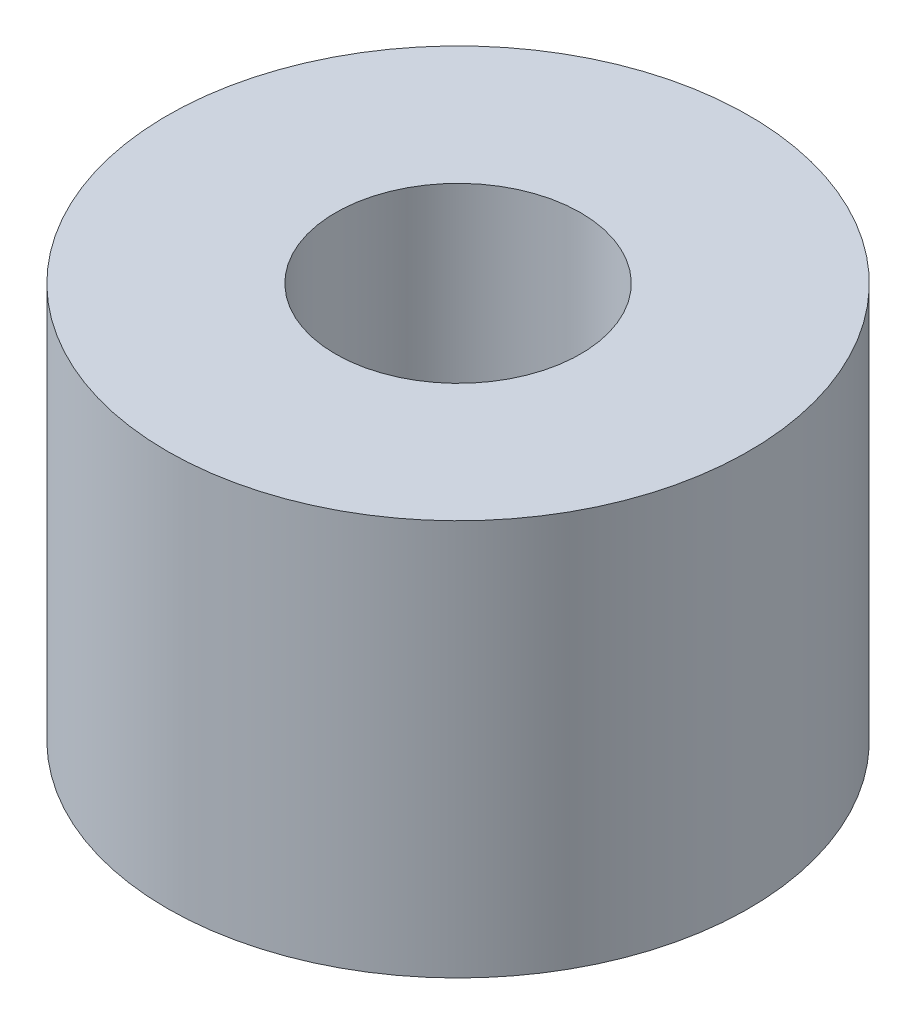
ISO-10303-21;
HEADER;
FILE_DESCRIPTION(('STEP AP214'),'2;1');
FILE_NAME('part.step','',(''),(''),'','','');
FILE_SCHEMA(('AUTOMOTIVE_DESIGN { 1 0 10303 214 1 1 1 1 }'));
ENDSEC;
DATA;
#1=APPLICATION_CONTEXT('core data for automotive mechanical design processes');
#2=APPLICATION_PROTOCOL_DEFINITION('international standard','automotive_design',2000,#1);
#3=PRODUCT_CONTEXT('',#1,'mechanical');
#4=PRODUCT('Part','Part','',(#3));
#5=PRODUCT_RELATED_PRODUCT_CATEGORY('part','',(#4));
#6=PRODUCT_DEFINITION_FORMATION('','',#4);
#7=PRODUCT_DEFINITION_CONTEXT('part definition',#1,'design');
#8=PRODUCT_DEFINITION('design','',#6,#7);
#9=PRODUCT_DEFINITION_SHAPE('','',#8);
#10=(LENGTH_UNIT() NAMED_UNIT(*) SI_UNIT(.MILLI.,.METRE.));
#11=(NAMED_UNIT(*) PLANE_ANGLE_UNIT() SI_UNIT($,.RADIAN.));
#12=(NAMED_UNIT(*) SI_UNIT($,.STERADIAN.) SOLID_ANGLE_UNIT());
#13=UNCERTAINTY_MEASURE_WITH_UNIT(LENGTH_MEASURE(1.E-05),#10,'distance_accuracy_value','');
#14=(GEOMETRIC_REPRESENTATION_CONTEXT(3) GLOBAL_UNCERTAINTY_ASSIGNED_CONTEXT((#13)) GLOBAL_UNIT_ASSIGNED_CONTEXT((#10,
#11,#12)) REPRESENTATION_CONTEXT('',''));
#15=CARTESIAN_POINT('',(0.,0.,0.));
#16=DIRECTION('',(0.,0.,1.));
#17=DIRECTION('',(1.,0.,0.));
#18=AXIS2_PLACEMENT_3D('',#15,#16,#17);
#19=CARTESIAN_POINT('',(5.875,8.,0.));
#20=DIRECTION('',(0.,-1.,0.));
#21=DIRECTION('',(0.,0.,-1.));
#22=AXIS2_PLACEMENT_3D('',#19,#20,#21);
#23=PLANE('',#22);
#24=CARTESIAN_POINT('',(0.,8.,0.));
#25=DIRECTION('',(0.,1.,0.));
#26=DIRECTION('',(0.,0.,1.));
#27=AXIS2_PLACEMENT_3D('',#24,#25,#26);
#28=CIRCLE('',#27,2.475);
#29=CARTESIAN_POINT('',(0.,8.,2.475));
#30=VERTEX_POINT('',#29);
#31=EDGE_CURVE('E10',#30,#30,#28,.T.);
#32=ORIENTED_EDGE('',*,*,#31,.F.);
#33=EDGE_LOOP('',(#32));
#34=FACE_BOUND('',#33,.T.);
#35=CARTESIAN_POINT('',(0.,8.,0.));
#36=DIRECTION('',(0.,1.,0.));
#37=DIRECTION('',(0.,0.,1.));
#38=AXIS2_PLACEMENT_3D('',#35,#36,#37);
#39=CIRCLE('',#38,5.875);
#40=CARTESIAN_POINT('',(0.,8.,5.875));
#41=VERTEX_POINT('',#40);
#42=EDGE_CURVE('E45',#41,#41,#39,.T.);
#43=ORIENTED_EDGE('',*,*,#42,.T.);
#44=EDGE_LOOP('',(#43));
#45=FACE_BOUND('',#44,.T.);
#46=ADVANCED_FACE('F31',(#34,#45),#23,.F.);
#47=CARTESIAN_POINT('',(0.,21.7485819631496,0.));
#48=DIRECTION('',(0.,1.,0.));
#49=DIRECTION('',(0.,0.,1.));
#50=AXIS2_PLACEMENT_3D('',#47,#48,#49);
#51=CYLINDRICAL_SURFACE('',#50,2.475);
#52=CARTESIAN_POINT('',(0.,0.,0.));
#53=DIRECTION('',(0.,1.,0.));
#54=DIRECTION('',(0.,0.,1.));
#55=AXIS2_PLACEMENT_3D('',#52,#53,#54);
#56=CIRCLE('',#55,2.475);
#57=CARTESIAN_POINT('',(0.,0.,2.475));
#58=VERTEX_POINT('',#57);
#59=EDGE_CURVE('E37',#58,#58,#56,.T.);
#60=ORIENTED_EDGE('',*,*,#59,.F.);
#61=EDGE_LOOP('',(#60));
#62=FACE_BOUND('',#61,.T.);
#63=ORIENTED_EDGE('',*,*,#31,.T.);
#64=EDGE_LOOP('',(#63));
#65=FACE_BOUND('',#64,.T.);
#66=ADVANCED_FACE('F60',(#62,#65),#51,.F.);
#67=CARTESIAN_POINT('',(2.475,0.,0.));
#68=DIRECTION('',(0.,1.,0.));
#69=DIRECTION('',(0.,0.,1.));
#70=AXIS2_PLACEMENT_3D('',#67,#68,#69);
#71=PLANE('',#70);
#72=CARTESIAN_POINT('',(0.,0.,0.));
#73=DIRECTION('',(0.,1.,0.));
#74=DIRECTION('',(0.,0.,1.));
#75=AXIS2_PLACEMENT_3D('',#72,#73,#74);
#76=CIRCLE('',#75,5.875);
#77=CARTESIAN_POINT('',(0.,0.,5.875));
#78=VERTEX_POINT('',#77);
#79=EDGE_CURVE('E41',#78,#78,#76,.T.);
#80=ORIENTED_EDGE('',*,*,#79,.F.);
#81=EDGE_LOOP('',(#80));
#82=FACE_BOUND('',#81,.T.);
#83=ORIENTED_EDGE('',*,*,#59,.T.);
#84=EDGE_LOOP('',(#83));
#85=FACE_BOUND('',#84,.T.);
#86=ADVANCED_FACE('F55',(#82,#85),#71,.F.);
#87=CARTESIAN_POINT('',(0.,21.7485819631496,0.));
#88=DIRECTION('',(0.,1.,0.));
#89=DIRECTION('',(0.,0.,1.));
#90=AXIS2_PLACEMENT_3D('',#87,#88,#89);
#91=CYLINDRICAL_SURFACE('',#90,5.875);
#92=ORIENTED_EDGE('',*,*,#42,.F.);
#93=EDGE_LOOP('',(#92));
#94=FACE_BOUND('',#93,.T.);
#95=ORIENTED_EDGE('',*,*,#79,.T.);
#96=EDGE_LOOP('',(#95));
#97=FACE_BOUND('',#96,.T.);
#98=ADVANCED_FACE('F52',(#94,#97),#91,.T.);
#99=CLOSED_SHELL('',(#46,#66,#86,#98));
#100=MANIFOLD_SOLID_BREP('B2',#99);
#101=ADVANCED_BREP_SHAPE_REPRESENTATION('',(#18,#100),#14);
#102=SHAPE_DEFINITION_REPRESENTATION(#9,#101);
ENDSEC;
END-ISO-10303-21;
